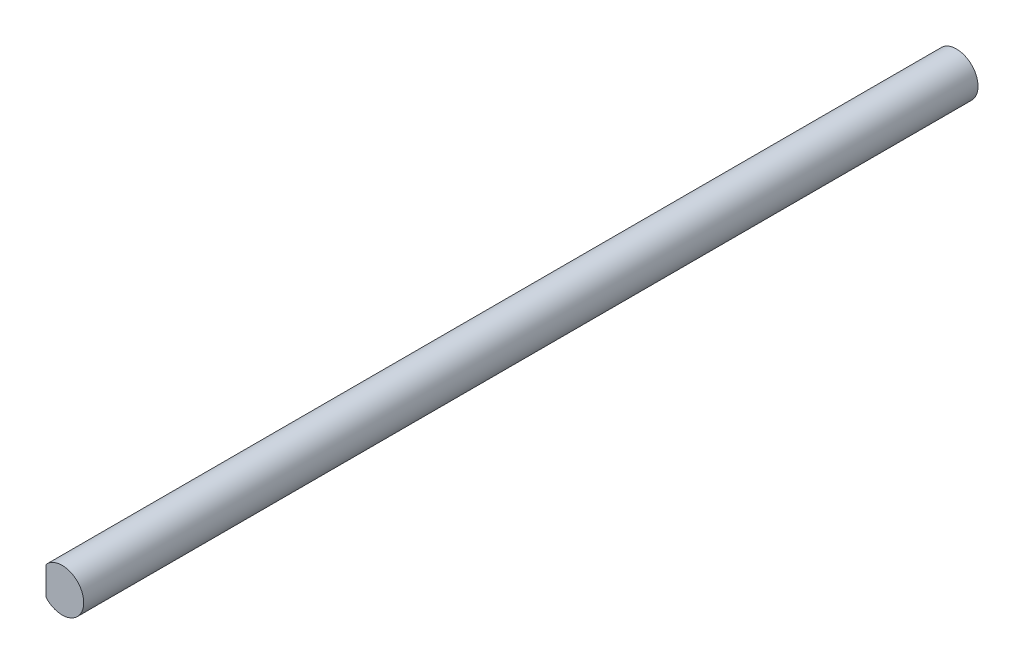
ISO-10303-21;
HEADER;
FILE_DESCRIPTION(('STEP AP214'),'2;1');
FILE_NAME('part.step','',(''),(''),'','','');
FILE_SCHEMA(('AUTOMOTIVE_DESIGN { 1 0 10303 214 1 1 1 1 }'));
ENDSEC;
DATA;
#1=APPLICATION_CONTEXT('core data for automotive mechanical design processes');
#2=APPLICATION_PROTOCOL_DEFINITION('international standard','automotive_design',2000,#1);
#3=PRODUCT_CONTEXT('',#1,'mechanical');
#4=PRODUCT('Part','Part','',(#3));
#5=PRODUCT_RELATED_PRODUCT_CATEGORY('part','',(#4));
#6=PRODUCT_DEFINITION_FORMATION('','',#4);
#7=PRODUCT_DEFINITION_CONTEXT('part definition',#1,'design');
#8=PRODUCT_DEFINITION('design','',#6,#7);
#9=PRODUCT_DEFINITION_SHAPE('','',#8);
#10=(LENGTH_UNIT() NAMED_UNIT(*) SI_UNIT(.MILLI.,.METRE.));
#11=(NAMED_UNIT(*) PLANE_ANGLE_UNIT() SI_UNIT($,.RADIAN.));
#12=(NAMED_UNIT(*) SI_UNIT($,.STERADIAN.) SOLID_ANGLE_UNIT());
#13=UNCERTAINTY_MEASURE_WITH_UNIT(LENGTH_MEASURE(1.E-05),#10,'distance_accuracy_value','');
#14=(GEOMETRIC_REPRESENTATION_CONTEXT(3) GLOBAL_UNCERTAINTY_ASSIGNED_CONTEXT((#13)) GLOBAL_UNIT_ASSIGNED_CONTEXT((#10,
#11,#12)) REPRESENTATION_CONTEXT('',''));
#15=CARTESIAN_POINT('',(0.,0.,0.));
#16=DIRECTION('',(0.,0.,1.));
#17=DIRECTION('',(1.,0.,0.));
#18=AXIS2_PLACEMENT_3D('',#15,#16,#17);
#19=CARTESIAN_POINT('',(0.,0.,166.));
#20=DIRECTION('',(0.,0.,-1.));
#21=DIRECTION('',(-1.,0.,0.));
#22=AXIS2_PLACEMENT_3D('',#19,#20,#21);
#23=CYLINDRICAL_SURFACE('',#22,4.);
#24=DIRECTION('',(0.,0.,-1.));
#25=VECTOR('',#24,1.);
#26=CARTESIAN_POINT('',(-3.,2.64575131106459,166.));
#27=LINE('',#26,#25);
#28=CARTESIAN_POINT('',(-3.,2.64575131106459,166.));
#29=VERTEX_POINT('',#28);
#30=CARTESIAN_POINT('',(-3.,2.64575131106459,0.));
#31=VERTEX_POINT('',#30);
#32=EDGE_CURVE('E52',#29,#31,#27,.T.);
#33=ORIENTED_EDGE('',*,*,#32,.F.);
#34=CARTESIAN_POINT('',(0.,0.,166.));
#35=DIRECTION('',(0.,0.,1.));
#36=DIRECTION('',(1.,0.,0.));
#37=AXIS2_PLACEMENT_3D('',#34,#35,#36);
#38=CIRCLE('',#37,4.);
#39=CARTESIAN_POINT('',(-3.,-2.64575131106459,166.));
#40=VERTEX_POINT('',#39);
#41=EDGE_CURVE('E46',#40,#29,#38,.T.);
#42=ORIENTED_EDGE('',*,*,#41,.F.);
#43=DIRECTION('',(0.,0.,-1.));
#44=VECTOR('',#43,1.);
#45=CARTESIAN_POINT('',(-3.,-2.64575131106459,166.));
#46=LINE('',#45,#44);
#47=CARTESIAN_POINT('',(-3.,-2.64575131106459,0.));
#48=VERTEX_POINT('',#47);
#49=EDGE_CURVE('E63',#48,#40,#46,.F.);
#50=ORIENTED_EDGE('',*,*,#49,.F.);
#51=CARTESIAN_POINT('',(0.,0.,0.));
#52=DIRECTION('',(0.,0.,1.));
#53=DIRECTION('',(1.,0.,0.));
#54=AXIS2_PLACEMENT_3D('',#51,#52,#53);
#55=CIRCLE('',#54,4.);
#56=EDGE_CURVE('E69',#48,#31,#55,.T.);
#57=ORIENTED_EDGE('',*,*,#56,.T.);
#58=EDGE_LOOP('',(#33,#42,#50,#57));
#59=FACE_BOUND('',#58,.T.);
#60=ADVANCED_FACE('F39',(#59),#23,.T.);
#61=CARTESIAN_POINT('',(0.,0.,166.));
#62=DIRECTION('',(0.,0.,1.));
#63=DIRECTION('',(1.,0.,0.));
#64=AXIS2_PLACEMENT_3D('',#61,#62,#63);
#65=PLANE('',#64);
#66=ORIENTED_EDGE('',*,*,#41,.T.);
#67=DIRECTION('',(0.,-1.,0.));
#68=VECTOR('',#67,1.);
#69=CARTESIAN_POINT('',(-3.,0.,166.));
#70=LINE('',#69,#68);
#71=EDGE_CURVE('E57',#29,#40,#70,.T.);
#72=ORIENTED_EDGE('',*,*,#71,.T.);
#73=EDGE_LOOP('',(#66,#72));
#74=FACE_BOUND('',#73,.T.);
#75=ADVANCED_FACE('F77',(#74),#65,.T.);
#76=CARTESIAN_POINT('',(0.,0.,0.));
#77=DIRECTION('',(0.,0.,1.));
#78=DIRECTION('',(1.,0.,0.));
#79=AXIS2_PLACEMENT_3D('',#76,#77,#78);
#80=PLANE('',#79);
#81=DIRECTION('',(0.,-1.,0.));
#82=VECTOR('',#81,1.);
#83=CARTESIAN_POINT('',(-3.,0.,0.));
#84=LINE('',#83,#82);
#85=EDGE_CURVE('E11',#31,#48,#84,.T.);
#86=ORIENTED_EDGE('',*,*,#85,.F.);
#87=ORIENTED_EDGE('',*,*,#56,.F.);
#88=EDGE_LOOP('',(#86,#87));
#89=FACE_BOUND('',#88,.T.);
#90=ADVANCED_FACE('F72',(#89),#80,.F.);
#91=CARTESIAN_POINT('',(-3.,-5.,166.1));
#92=DIRECTION('',(-1.,0.,0.));
#93=DIRECTION('',(0.,0.,1.));
#94=AXIS2_PLACEMENT_3D('',#91,#92,#93);
#95=PLANE('',#94);
#96=ORIENTED_EDGE('',*,*,#32,.T.);
#97=ORIENTED_EDGE('',*,*,#85,.T.);
#98=ORIENTED_EDGE('',*,*,#49,.T.);
#99=ORIENTED_EDGE('',*,*,#71,.F.);
#100=EDGE_LOOP('',(#96,#97,#98,#99));
#101=FACE_BOUND('',#100,.T.);
#102=ADVANCED_FACE('F62',(#101),#95,.T.);
#103=CLOSED_SHELL('',(#60,#75,#90,#102));
#104=MANIFOLD_SOLID_BREP('B2',#103);
#105=ADVANCED_BREP_SHAPE_REPRESENTATION('',(#18,#104),#14);
#106=SHAPE_DEFINITION_REPRESENTATION(#9,#105);
ENDSEC;
END-ISO-10303-21;
